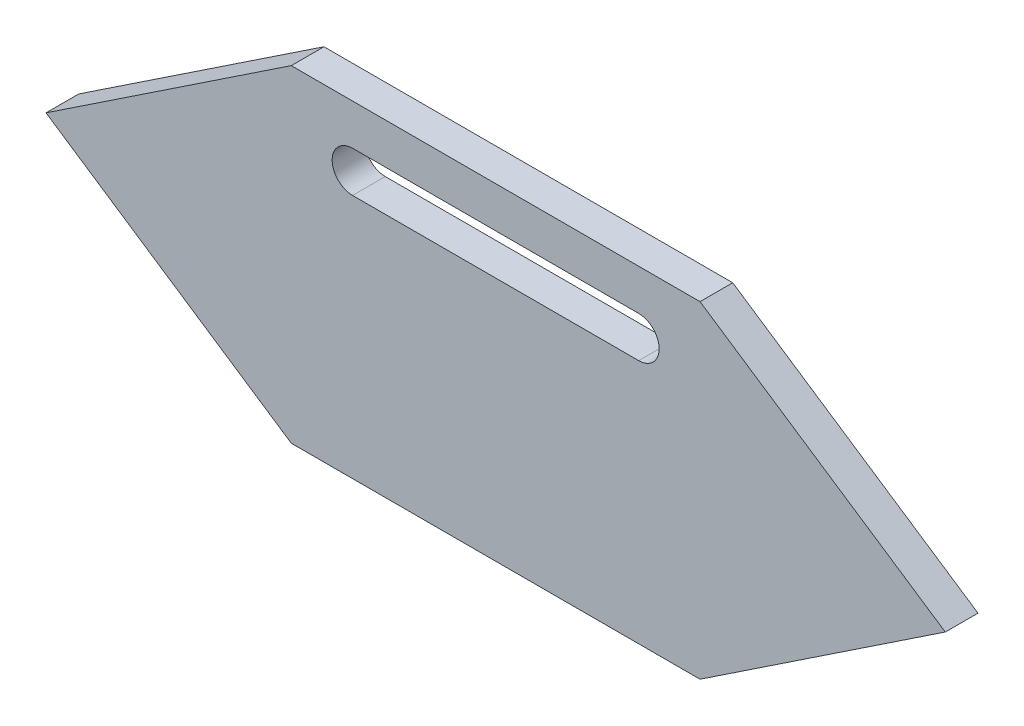
ISO-10303-21;
HEADER;
FILE_DESCRIPTION(('STEP AP214'),'2;1');
FILE_NAME('part.step','',(''),(''),'','','');
FILE_SCHEMA(('AUTOMOTIVE_DESIGN { 1 0 10303 214 1 1 1 1 }'));
ENDSEC;
DATA;
#1=APPLICATION_CONTEXT('core data for automotive mechanical design processes');
#2=APPLICATION_PROTOCOL_DEFINITION('international standard','automotive_design',2000,#1);
#3=PRODUCT_CONTEXT('',#1,'mechanical');
#4=PRODUCT('Part','Part','',(#3));
#5=PRODUCT_RELATED_PRODUCT_CATEGORY('part','',(#4));
#6=PRODUCT_DEFINITION_FORMATION('','',#4);
#7=PRODUCT_DEFINITION_CONTEXT('part definition',#1,'design');
#8=PRODUCT_DEFINITION('design','',#6,#7);
#9=PRODUCT_DEFINITION_SHAPE('','',#8);
#10=(LENGTH_UNIT() NAMED_UNIT(*) SI_UNIT(.MILLI.,.METRE.));
#11=(NAMED_UNIT(*) PLANE_ANGLE_UNIT() SI_UNIT($,.RADIAN.));
#12=(NAMED_UNIT(*) SI_UNIT($,.STERADIAN.) SOLID_ANGLE_UNIT());
#13=UNCERTAINTY_MEASURE_WITH_UNIT(LENGTH_MEASURE(1.E-05),#10,'distance_accuracy_value','');
#14=(GEOMETRIC_REPRESENTATION_CONTEXT(3) GLOBAL_UNCERTAINTY_ASSIGNED_CONTEXT((#13)) GLOBAL_UNIT_ASSIGNED_CONTEXT((#10,
#11,#12)) REPRESENTATION_CONTEXT('',''));
#15=CARTESIAN_POINT('',(0.,0.,0.));
#16=DIRECTION('',(0.,0.,1.));
#17=DIRECTION('',(1.,0.,0.));
#18=AXIS2_PLACEMENT_3D('',#15,#16,#17);
#19=CARTESIAN_POINT('',(0.,0.,5.08));
#20=DIRECTION('',(0.,0.,-1.));
#21=DIRECTION('',(-1.,0.,0.));
#22=AXIS2_PLACEMENT_3D('',#19,#20,#21);
#23=PLANE('',#22);
#24=DIRECTION('',(-0.832050294337844,0.554700196225229,0.));
#25=VECTOR('',#24,1.);
#26=CARTESIAN_POINT('',(63.5,50.8,5.08));
#27=LINE('',#26,#25);
#28=CARTESIAN_POINT('',(139.7,0.,5.08));
#29=VERTEX_POINT('',#28);
#30=CARTESIAN_POINT('',(63.5,50.8,5.08));
#31=VERTEX_POINT('',#30);
#32=EDGE_CURVE('E146',#29,#31,#27,.T.);
#33=ORIENTED_EDGE('',*,*,#32,.T.);
#34=DIRECTION('',(-1.,0.,0.));
#35=VECTOR('',#34,1.);
#36=CARTESIAN_POINT('',(-63.5,50.8,5.08));
#37=LINE('',#36,#35);
#38=CARTESIAN_POINT('',(-63.5,50.8,5.08));
#39=VERTEX_POINT('',#38);
#40=EDGE_CURVE('E149',#31,#39,#37,.T.);
#41=ORIENTED_EDGE('',*,*,#40,.T.);
#42=DIRECTION('',(-0.832050294337844,-0.554700196225229,0.));
#43=VECTOR('',#42,1.);
#44=CARTESIAN_POINT('',(-63.5,50.8,5.08));
#45=LINE('',#44,#43);
#46=CARTESIAN_POINT('',(-139.7,0.,5.08));
#47=VERTEX_POINT('',#46);
#48=EDGE_CURVE('E152',#39,#47,#45,.T.);
#49=ORIENTED_EDGE('',*,*,#48,.T.);
#50=DIRECTION('',(0.832050294337844,-0.554700196225229,0.));
#51=VECTOR('',#50,1.);
#52=CARTESIAN_POINT('',(-139.7,0.,5.08));
#53=LINE('',#52,#51);
#54=CARTESIAN_POINT('',(-63.5,-50.8,5.08));
#55=VERTEX_POINT('',#54);
#56=EDGE_CURVE('E154',#47,#55,#53,.T.);
#57=ORIENTED_EDGE('',*,*,#56,.T.);
#58=DIRECTION('',(1.,0.,0.));
#59=VECTOR('',#58,1.);
#60=CARTESIAN_POINT('',(63.5,-50.8,5.08));
#61=LINE('',#60,#59);
#62=CARTESIAN_POINT('',(63.5,-50.8,5.08));
#63=VERTEX_POINT('',#62);
#64=EDGE_CURVE('E156',#55,#63,#61,.T.);
#65=ORIENTED_EDGE('',*,*,#64,.T.);
#66=DIRECTION('',(0.832050294337844,0.554700196225229,0.));
#67=VECTOR('',#66,1.);
#68=CARTESIAN_POINT('',(139.7,0.,5.08));
#69=LINE('',#68,#67);
#70=EDGE_CURVE('E158',#63,#29,#69,.T.);
#71=ORIENTED_EDGE('',*,*,#70,.T.);
#72=EDGE_LOOP('',(#33,#41,#49,#57,#65,#71));
#73=FACE_BOUND('',#72,.T.);
#74=CARTESIAN_POINT('',(44.45,31.75,5.08));
#75=DIRECTION('',(0.,0.,1.));
#76=DIRECTION('',(1.,0.,0.));
#77=AXIS2_PLACEMENT_3D('',#74,#75,#76);
#78=CIRCLE('',#77,6.35000000000001);
#79=CARTESIAN_POINT('',(44.45,25.4,5.08));
#80=VERTEX_POINT('',#79);
#81=CARTESIAN_POINT('',(44.45,38.1,5.08));
#82=VERTEX_POINT('',#81);
#83=EDGE_CURVE('E110',#80,#82,#78,.T.);
#84=ORIENTED_EDGE('',*,*,#83,.F.);
#85=DIRECTION('',(1.,0.,0.));
#86=VECTOR('',#85,1.);
#87=CARTESIAN_POINT('',(-44.45,25.4,5.08));
#88=LINE('',#87,#86);
#89=CARTESIAN_POINT('',(-44.45,25.4,5.08));
#90=VERTEX_POINT('',#89);
#91=EDGE_CURVE('E132',#90,#80,#88,.T.);
#92=ORIENTED_EDGE('',*,*,#91,.F.);
#93=CARTESIAN_POINT('',(-44.45,31.75,5.08));
#94=DIRECTION('',(0.,0.,1.));
#95=DIRECTION('',(-1.,0.,0.));
#96=AXIS2_PLACEMENT_3D('',#93,#94,#95);
#97=CIRCLE('',#96,6.35000000000001);
#98=CARTESIAN_POINT('',(-44.45,38.1,5.08));
#99=VERTEX_POINT('',#98);
#100=EDGE_CURVE('E130',#99,#90,#97,.T.);
#101=ORIENTED_EDGE('',*,*,#100,.F.);
#102=DIRECTION('',(-1.,0.,0.));
#103=VECTOR('',#102,1.);
#104=CARTESIAN_POINT('',(-44.45,38.1,5.08));
#105=LINE('',#104,#103);
#106=EDGE_CURVE('E118',#82,#99,#105,.T.);
#107=ORIENTED_EDGE('',*,*,#106,.F.);
#108=EDGE_LOOP('',(#84,#92,#101,#107));
#109=FACE_BOUND('',#108,.T.);
#110=ADVANCED_FACE('F33',(#73,#109),#23,.F.);
#111=CARTESIAN_POINT('',(0.,0.,-5.08));
#112=DIRECTION('',(0.,0.,-1.));
#113=DIRECTION('',(-1.,0.,0.));
#114=AXIS2_PLACEMENT_3D('',#111,#112,#113);
#115=PLANE('',#114);
#116=DIRECTION('',(-0.832050294337844,0.554700196225229,0.));
#117=VECTOR('',#116,1.);
#118=CARTESIAN_POINT('',(63.5,50.8,-5.08));
#119=LINE('',#118,#117);
#120=CARTESIAN_POINT('',(139.7,0.,-5.08));
#121=VERTEX_POINT('',#120);
#122=CARTESIAN_POINT('',(63.5,50.8,-5.08));
#123=VERTEX_POINT('',#122);
#124=EDGE_CURVE('E126',#121,#123,#119,.T.);
#125=ORIENTED_EDGE('',*,*,#124,.F.);
#126=DIRECTION('',(0.832050294337844,0.554700196225229,0.));
#127=VECTOR('',#126,1.);
#128=CARTESIAN_POINT('',(139.7,0.,-5.08));
#129=LINE('',#128,#127);
#130=CARTESIAN_POINT('',(63.5,-50.8,-5.08));
#131=VERTEX_POINT('',#130);
#132=EDGE_CURVE('E150',#131,#121,#129,.T.);
#133=ORIENTED_EDGE('',*,*,#132,.F.);
#134=DIRECTION('',(1.,0.,0.));
#135=VECTOR('',#134,1.);
#136=CARTESIAN_POINT('',(63.5,-50.8,-5.08));
#137=LINE('',#136,#135);
#138=CARTESIAN_POINT('',(-63.5,-50.8,-5.08));
#139=VERTEX_POINT('',#138);
#140=EDGE_CURVE('E169',#139,#131,#137,.T.);
#141=ORIENTED_EDGE('',*,*,#140,.F.);
#142=DIRECTION('',(0.832050294337844,-0.554700196225229,0.));
#143=VECTOR('',#142,1.);
#144=CARTESIAN_POINT('',(-139.7,0.,-5.08));
#145=LINE('',#144,#143);
#146=CARTESIAN_POINT('',(-139.7,0.,-5.08));
#147=VERTEX_POINT('',#146);
#148=EDGE_CURVE('E167',#147,#139,#145,.T.);
#149=ORIENTED_EDGE('',*,*,#148,.F.);
#150=DIRECTION('',(-0.832050294337844,-0.554700196225229,0.));
#151=VECTOR('',#150,1.);
#152=CARTESIAN_POINT('',(-63.5,50.8,-5.08));
#153=LINE('',#152,#151);
#154=CARTESIAN_POINT('',(-63.5,50.8,-5.08));
#155=VERTEX_POINT('',#154);
#156=EDGE_CURVE('E165',#155,#147,#153,.T.);
#157=ORIENTED_EDGE('',*,*,#156,.F.);
#158=DIRECTION('',(-1.,0.,0.));
#159=VECTOR('',#158,1.);
#160=CARTESIAN_POINT('',(-63.5,50.8,-5.08));
#161=LINE('',#160,#159);
#162=EDGE_CURVE('E163',#123,#155,#161,.T.);
#163=ORIENTED_EDGE('',*,*,#162,.F.);
#164=EDGE_LOOP('',(#125,#133,#141,#149,#157,#163));
#165=FACE_BOUND('',#164,.T.);
#166=DIRECTION('',(1.,0.,0.));
#167=VECTOR('',#166,1.);
#168=CARTESIAN_POINT('',(-44.45,25.4,-5.08));
#169=LINE('',#168,#167);
#170=CARTESIAN_POINT('',(-44.45,25.4,-5.08));
#171=VERTEX_POINT('',#170);
#172=CARTESIAN_POINT('',(44.45,25.4,-5.08));
#173=VERTEX_POINT('',#172);
#174=EDGE_CURVE('E119',#171,#173,#169,.T.);
#175=ORIENTED_EDGE('',*,*,#174,.T.);
#176=CARTESIAN_POINT('',(44.45,31.75,-5.08));
#177=DIRECTION('',(0.,0.,1.));
#178=DIRECTION('',(1.,0.,0.));
#179=AXIS2_PLACEMENT_3D('',#176,#177,#178);
#180=CIRCLE('',#179,6.35000000000001);
#181=CARTESIAN_POINT('',(44.45,38.1,-5.08));
#182=VERTEX_POINT('',#181);
#183=EDGE_CURVE('E56',#173,#182,#180,.T.);
#184=ORIENTED_EDGE('',*,*,#183,.T.);
#185=DIRECTION('',(-1.,0.,0.));
#186=VECTOR('',#185,1.);
#187=CARTESIAN_POINT('',(-44.45,38.1,-5.08));
#188=LINE('',#187,#186);
#189=CARTESIAN_POINT('',(-44.45,38.1,-5.08));
#190=VERTEX_POINT('',#189);
#191=EDGE_CURVE('E125',#182,#190,#188,.T.);
#192=ORIENTED_EDGE('',*,*,#191,.T.);
#193=CARTESIAN_POINT('',(-44.45,31.75,-5.08));
#194=DIRECTION('',(0.,0.,1.));
#195=DIRECTION('',(-1.,0.,0.));
#196=AXIS2_PLACEMENT_3D('',#193,#194,#195);
#197=CIRCLE('',#196,6.35000000000001);
#198=EDGE_CURVE('E138',#190,#171,#197,.T.);
#199=ORIENTED_EDGE('',*,*,#198,.T.);
#200=EDGE_LOOP('',(#175,#184,#192,#199));
#201=FACE_BOUND('',#200,.T.);
#202=ADVANCED_FACE('F193',(#165,#201),#115,.T.);
#203=CARTESIAN_POINT('',(63.5,50.8,5.08));
#204=DIRECTION('',(-0.554700196225229,-0.832050294337844,0.));
#205=DIRECTION('',(0.832050294337844,-0.554700196225229,0.));
#206=AXIS2_PLACEMENT_3D('',#203,#204,#205);
#207=PLANE('',#206);
#208=ORIENTED_EDGE('',*,*,#124,.T.);
#209=DIRECTION('',(0.,0.,-1.));
#210=VECTOR('',#209,1.);
#211=CARTESIAN_POINT('',(63.5,50.8,5.08));
#212=LINE('',#211,#210);
#213=EDGE_CURVE('E11',#31,#123,#212,.T.);
#214=ORIENTED_EDGE('',*,*,#213,.F.);
#215=ORIENTED_EDGE('',*,*,#32,.F.);
#216=DIRECTION('',(0.,0.,-1.));
#217=VECTOR('',#216,1.);
#218=CARTESIAN_POINT('',(139.7,0.,5.08));
#219=LINE('',#218,#217);
#220=EDGE_CURVE('E160',#29,#121,#219,.T.);
#221=ORIENTED_EDGE('',*,*,#220,.T.);
#222=EDGE_LOOP('',(#208,#214,#215,#221));
#223=FACE_BOUND('',#222,.T.);
#224=ADVANCED_FACE('F35',(#223),#207,.F.);
#225=CARTESIAN_POINT('',(-63.5,50.8,5.08));
#226=DIRECTION('',(0.,-1.,0.));
#227=DIRECTION('',(0.,0.,-1.));
#228=AXIS2_PLACEMENT_3D('',#225,#226,#227);
#229=PLANE('',#228);
#230=ORIENTED_EDGE('',*,*,#162,.T.);
#231=DIRECTION('',(0.,0.,-1.));
#232=VECTOR('',#231,1.);
#233=CARTESIAN_POINT('',(-63.5,50.8,5.08));
#234=LINE('',#233,#232);
#235=EDGE_CURVE('E41',#39,#155,#234,.T.);
#236=ORIENTED_EDGE('',*,*,#235,.F.);
#237=ORIENTED_EDGE('',*,*,#40,.F.);
#238=ORIENTED_EDGE('',*,*,#213,.T.);
#239=EDGE_LOOP('',(#230,#236,#237,#238));
#240=FACE_BOUND('',#239,.T.);
#241=ADVANCED_FACE('F210',(#240),#229,.F.);
#242=CARTESIAN_POINT('',(-63.5,50.8,5.08));
#243=DIRECTION('',(0.554700196225229,-0.832050294337844,0.));
#244=DIRECTION('',(0.832050294337844,0.554700196225229,0.));
#245=AXIS2_PLACEMENT_3D('',#242,#243,#244);
#246=PLANE('',#245);
#247=ORIENTED_EDGE('',*,*,#156,.T.);
#248=DIRECTION('',(0.,0.,-1.));
#249=VECTOR('',#248,1.);
#250=CARTESIAN_POINT('',(-139.7,0.,5.08));
#251=LINE('',#250,#249);
#252=EDGE_CURVE('E180',#47,#147,#251,.T.);
#253=ORIENTED_EDGE('',*,*,#252,.F.);
#254=ORIENTED_EDGE('',*,*,#48,.F.);
#255=ORIENTED_EDGE('',*,*,#235,.T.);
#256=EDGE_LOOP('',(#247,#253,#254,#255));
#257=FACE_BOUND('',#256,.T.);
#258=ADVANCED_FACE('F187',(#257),#246,.F.);
#259=CARTESIAN_POINT('',(-139.7,0.,5.08));
#260=DIRECTION('',(0.554700196225229,0.832050294337844,0.));
#261=DIRECTION('',(-0.832050294337844,0.554700196225229,0.));
#262=AXIS2_PLACEMENT_3D('',#259,#260,#261);
#263=PLANE('',#262);
#264=ORIENTED_EDGE('',*,*,#148,.T.);
#265=DIRECTION('',(0.,0.,-1.));
#266=VECTOR('',#265,1.);
#267=CARTESIAN_POINT('',(-63.5,-50.8,5.08));
#268=LINE('',#267,#266);
#269=EDGE_CURVE('E177',#55,#139,#268,.T.);
#270=ORIENTED_EDGE('',*,*,#269,.F.);
#271=ORIENTED_EDGE('',*,*,#56,.F.);
#272=ORIENTED_EDGE('',*,*,#252,.T.);
#273=EDGE_LOOP('',(#264,#270,#271,#272));
#274=FACE_BOUND('',#273,.T.);
#275=ADVANCED_FACE('F199',(#274),#263,.F.);
#276=CARTESIAN_POINT('',(63.5,-50.8,5.08));
#277=DIRECTION('',(0.,1.,0.));
#278=DIRECTION('',(0.,0.,1.));
#279=AXIS2_PLACEMENT_3D('',#276,#277,#278);
#280=PLANE('',#279);
#281=ORIENTED_EDGE('',*,*,#140,.T.);
#282=DIRECTION('',(0.,0.,-1.));
#283=VECTOR('',#282,1.);
#284=CARTESIAN_POINT('',(63.5,-50.8,5.08));
#285=LINE('',#284,#283);
#286=EDGE_CURVE('E174',#63,#131,#285,.T.);
#287=ORIENTED_EDGE('',*,*,#286,.F.);
#288=ORIENTED_EDGE('',*,*,#64,.F.);
#289=ORIENTED_EDGE('',*,*,#269,.T.);
#290=EDGE_LOOP('',(#281,#287,#288,#289));
#291=FACE_BOUND('',#290,.T.);
#292=ADVANCED_FACE('F203',(#291),#280,.F.);
#293=CARTESIAN_POINT('',(139.7,0.,5.08));
#294=DIRECTION('',(-0.554700196225229,0.832050294337844,0.));
#295=DIRECTION('',(-0.832050294337844,-0.554700196225229,0.));
#296=AXIS2_PLACEMENT_3D('',#293,#294,#295);
#297=PLANE('',#296);
#298=ORIENTED_EDGE('',*,*,#132,.T.);
#299=ORIENTED_EDGE('',*,*,#220,.F.);
#300=ORIENTED_EDGE('',*,*,#70,.F.);
#301=ORIENTED_EDGE('',*,*,#286,.T.);
#302=EDGE_LOOP('',(#298,#299,#300,#301));
#303=FACE_BOUND('',#302,.T.);
#304=ADVANCED_FACE('F213',(#303),#297,.F.);
#305=CARTESIAN_POINT('',(44.45,31.75,5.08));
#306=DIRECTION('',(0.,0.,-1.));
#307=DIRECTION('',(-1.,0.,0.));
#308=AXIS2_PLACEMENT_3D('',#305,#306,#307);
#309=CYLINDRICAL_SURFACE('',#308,6.35000000000001);
#310=ORIENTED_EDGE('',*,*,#183,.F.);
#311=DIRECTION('',(0.,0.,-1.));
#312=VECTOR('',#311,1.);
#313=CARTESIAN_POINT('',(44.45,25.4,5.08));
#314=LINE('',#313,#312);
#315=EDGE_CURVE('E114',#80,#173,#314,.T.);
#316=ORIENTED_EDGE('',*,*,#315,.F.);
#317=ORIENTED_EDGE('',*,*,#83,.T.);
#318=DIRECTION('',(0.,0.,-1.));
#319=VECTOR('',#318,1.);
#320=CARTESIAN_POINT('',(44.45,38.1,5.08));
#321=LINE('',#320,#319);
#322=EDGE_CURVE('E113',#82,#182,#321,.T.);
#323=ORIENTED_EDGE('',*,*,#322,.T.);
#324=EDGE_LOOP('',(#310,#316,#317,#323));
#325=FACE_BOUND('',#324,.T.);
#326=ADVANCED_FACE('F112',(#325),#309,.F.);
#327=CARTESIAN_POINT('',(-44.45,38.1,5.08));
#328=DIRECTION('',(0.,-1.,0.));
#329=DIRECTION('',(0.,0.,-1.));
#330=AXIS2_PLACEMENT_3D('',#327,#328,#329);
#331=PLANE('',#330);
#332=ORIENTED_EDGE('',*,*,#191,.F.);
#333=ORIENTED_EDGE('',*,*,#322,.F.);
#334=ORIENTED_EDGE('',*,*,#106,.T.);
#335=DIRECTION('',(0.,0.,-1.));
#336=VECTOR('',#335,1.);
#337=CARTESIAN_POINT('',(-44.45,38.1,5.08));
#338=LINE('',#337,#336);
#339=EDGE_CURVE('E127',#99,#190,#338,.T.);
#340=ORIENTED_EDGE('',*,*,#339,.T.);
#341=EDGE_LOOP('',(#332,#333,#334,#340));
#342=FACE_BOUND('',#341,.T.);
#343=ADVANCED_FACE('F122',(#342),#331,.T.);
#344=CARTESIAN_POINT('',(-44.45,31.75,5.08));
#345=DIRECTION('',(0.,0.,-1.));
#346=DIRECTION('',(-1.,0.,0.));
#347=AXIS2_PLACEMENT_3D('',#344,#345,#346);
#348=CYLINDRICAL_SURFACE('',#347,6.35000000000001);
#349=ORIENTED_EDGE('',*,*,#198,.F.);
#350=ORIENTED_EDGE('',*,*,#339,.F.);
#351=ORIENTED_EDGE('',*,*,#100,.T.);
#352=DIRECTION('',(0.,0.,-1.));
#353=VECTOR('',#352,1.);
#354=CARTESIAN_POINT('',(-44.45,25.4,5.08));
#355=LINE('',#354,#353);
#356=EDGE_CURVE('E48',#90,#171,#355,.T.);
#357=ORIENTED_EDGE('',*,*,#356,.T.);
#358=EDGE_LOOP('',(#349,#350,#351,#357));
#359=FACE_BOUND('',#358,.T.);
#360=ADVANCED_FACE('F231',(#359),#348,.F.);
#361=CARTESIAN_POINT('',(-44.45,25.4,5.08));
#362=DIRECTION('',(0.,1.,0.));
#363=DIRECTION('',(0.,0.,1.));
#364=AXIS2_PLACEMENT_3D('',#361,#362,#363);
#365=PLANE('',#364);
#366=ORIENTED_EDGE('',*,*,#174,.F.);
#367=ORIENTED_EDGE('',*,*,#356,.F.);
#368=ORIENTED_EDGE('',*,*,#91,.T.);
#369=ORIENTED_EDGE('',*,*,#315,.T.);
#370=EDGE_LOOP('',(#366,#367,#368,#369));
#371=FACE_BOUND('',#370,.T.);
#372=ADVANCED_FACE('F234',(#371),#365,.T.);
#373=CLOSED_SHELL('',(#110,#202,#224,#241,#258,#275,#292,#304,#326,#343,#360,#372));
#374=MANIFOLD_SOLID_BREP('B2',#373);
#375=ADVANCED_BREP_SHAPE_REPRESENTATION('',(#18,#374),#14);
#376=SHAPE_DEFINITION_REPRESENTATION(#9,#375);
ENDSEC;
END-ISO-10303-21;
